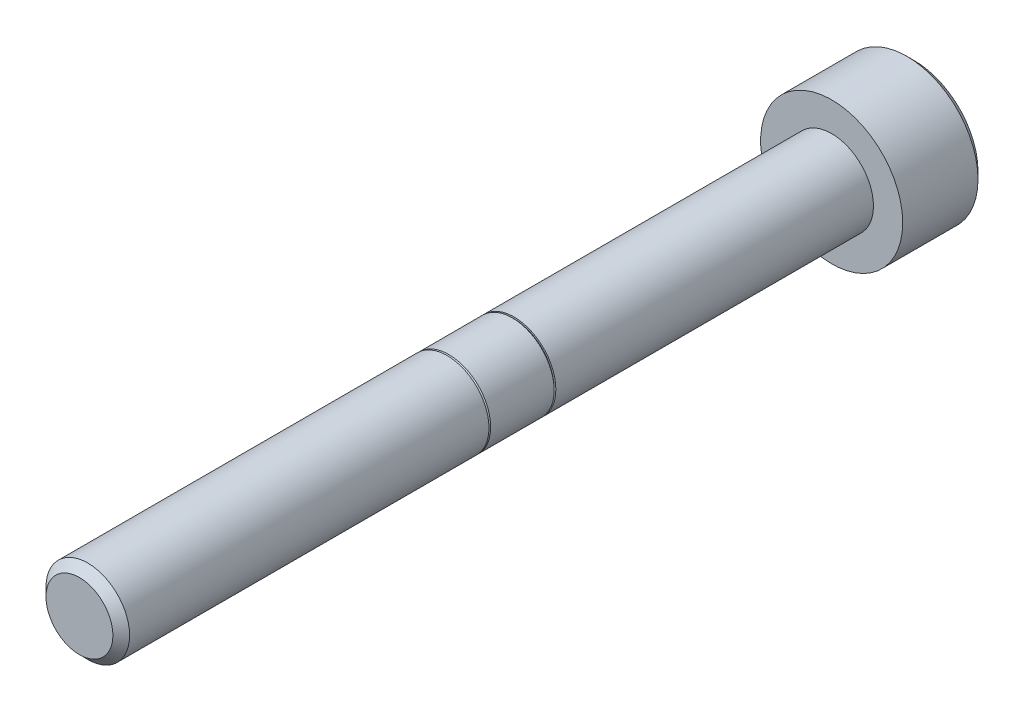
ISO-10303-21;
HEADER;
FILE_DESCRIPTION(('STEP AP214'),'2;1');
FILE_NAME('part.step','',(''),(''),'','','');
FILE_SCHEMA(('AUTOMOTIVE_DESIGN { 1 0 10303 214 1 1 1 1 }'));
ENDSEC;
DATA;
#1=APPLICATION_CONTEXT('core data for automotive mechanical design processes');
#2=APPLICATION_PROTOCOL_DEFINITION('international standard','automotive_design',2000,#1);
#3=PRODUCT_CONTEXT('',#1,'mechanical');
#4=PRODUCT('Part','Part','',(#3));
#5=PRODUCT_RELATED_PRODUCT_CATEGORY('part','',(#4));
#6=PRODUCT_DEFINITION_FORMATION('','',#4);
#7=PRODUCT_DEFINITION_CONTEXT('part definition',#1,'design');
#8=PRODUCT_DEFINITION('design','',#6,#7);
#9=PRODUCT_DEFINITION_SHAPE('','',#8);
#10=(LENGTH_UNIT() NAMED_UNIT(*) SI_UNIT(.MILLI.,.METRE.));
#11=(NAMED_UNIT(*) PLANE_ANGLE_UNIT() SI_UNIT($,.RADIAN.));
#12=(NAMED_UNIT(*) SI_UNIT($,.STERADIAN.) SOLID_ANGLE_UNIT());
#13=UNCERTAINTY_MEASURE_WITH_UNIT(LENGTH_MEASURE(1.E-05),#10,'distance_accuracy_value','');
#14=(GEOMETRIC_REPRESENTATION_CONTEXT(3) GLOBAL_UNCERTAINTY_ASSIGNED_CONTEXT((#13)) GLOBAL_UNIT_ASSIGNED_CONTEXT((#10,
#11,#12)) REPRESENTATION_CONTEXT('',''));
#15=CARTESIAN_POINT('',(0.,0.,0.));
#16=DIRECTION('',(0.,0.,1.));
#17=DIRECTION('',(1.,0.,0.));
#18=AXIS2_PLACEMENT_3D('',#15,#16,#17);
#19=CARTESIAN_POINT('',(0.,0.,-2.43));
#20=DIRECTION('',(0.,0.,1.));
#21=DIRECTION('',(1.,0.,0.));
#22=AXIS2_PLACEMENT_3D('',#19,#20,#21);
#23=PLANE('',#22);
#24=DIRECTION('',(0.866025403784439,0.499999999999999,0.));
#25=VECTOR('',#24,1.);
#26=CARTESIAN_POINT('',(2.,-1.15470053837925,-2.43));
#27=LINE('',#26,#25);
#28=CARTESIAN_POINT('',(2.,-1.15470053837925,-2.43));
#29=VERTEX_POINT('',#28);
#30=CARTESIAN_POINT('',(0.,-2.3094010767585,-2.43));
#31=VERTEX_POINT('',#30);
#32=EDGE_CURVE('E140',#29,#31,#27,.F.);
#33=ORIENTED_EDGE('',*,*,#32,.T.);
#34=DIRECTION('',(0.866025403784438,-0.5,0.));
#35=VECTOR('',#34,1.);
#36=CARTESIAN_POINT('',(0.,-2.3094010767585,-2.43));
#37=LINE('',#36,#35);
#38=CARTESIAN_POINT('',(-2.,-1.15470053837925,-2.43));
#39=VERTEX_POINT('',#38);
#40=EDGE_CURVE('E74',#31,#39,#37,.F.);
#41=ORIENTED_EDGE('',*,*,#40,.T.);
#42=DIRECTION('',(0.,1.,0.));
#43=VECTOR('',#42,1.);
#44=CARTESIAN_POINT('',(-2.,-1.15470053837925,-2.43));
#45=LINE('',#44,#43);
#46=CARTESIAN_POINT('',(-2.,1.15470053837925,-2.43));
#47=VERTEX_POINT('',#46);
#48=EDGE_CURVE('E71',#39,#47,#45,.T.);
#49=ORIENTED_EDGE('',*,*,#48,.T.);
#50=DIRECTION('',(-0.866025403784439,-0.5,0.));
#51=VECTOR('',#50,1.);
#52=CARTESIAN_POINT('',(-2.,1.15470053837925,-2.43));
#53=LINE('',#52,#51);
#54=CARTESIAN_POINT('',(0.,2.3094010767585,-2.43));
#55=VERTEX_POINT('',#54);
#56=EDGE_CURVE('E68',#47,#55,#53,.F.);
#57=ORIENTED_EDGE('',*,*,#56,.T.);
#58=DIRECTION('',(-0.866025403784439,0.5,0.));
#59=VECTOR('',#58,1.);
#60=CARTESIAN_POINT('',(0.,2.3094010767585,-2.43));
#61=LINE('',#60,#59);
#62=CARTESIAN_POINT('',(2.,1.15470053837925,-2.43));
#63=VERTEX_POINT('',#62);
#64=EDGE_CURVE('E91',#55,#63,#61,.F.);
#65=ORIENTED_EDGE('',*,*,#64,.T.);
#66=DIRECTION('',(0.,1.,0.));
#67=VECTOR('',#66,1.);
#68=CARTESIAN_POINT('',(2.,1.15470053837925,-2.43));
#69=LINE('',#68,#67);
#70=EDGE_CURVE('E145',#63,#29,#69,.F.);
#71=ORIENTED_EDGE('',*,*,#70,.T.);
#72=EDGE_LOOP('',(#33,#41,#49,#57,#65,#71));
#73=FACE_BOUND('',#72,.T.);
#74=ADVANCED_FACE('F17',(#73),#23,.F.);
#75=CARTESIAN_POINT('',(-2.,-1.15470053837925,-4.93));
#76=DIRECTION('',(-1.,0.,0.));
#77=DIRECTION('',(0.,0.,1.));
#78=AXIS2_PLACEMENT_3D('',#75,#76,#77);
#79=PLANE('',#78);
#80=ORIENTED_EDGE('',*,*,#48,.F.);
#81=DIRECTION('',(0.,0.,1.));
#82=VECTOR('',#81,1.);
#83=CARTESIAN_POINT('',(-2.,-1.15470053837925,-4.93));
#84=LINE('',#83,#82);
#85=CARTESIAN_POINT('',(-2.,-1.15470053837925,-4.93));
#86=VERTEX_POINT('',#85);
#87=EDGE_CURVE('E135',#39,#86,#84,.F.);
#88=ORIENTED_EDGE('',*,*,#87,.T.);
#89=DIRECTION('',(0.,1.,0.));
#90=VECTOR('',#89,1.);
#91=CARTESIAN_POINT('',(-2.,0.,-4.93));
#92=LINE('',#91,#90);
#93=CARTESIAN_POINT('',(-2.,1.15470053837925,-4.93));
#94=VERTEX_POINT('',#93);
#95=EDGE_CURVE('E82',#86,#94,#92,.T.);
#96=ORIENTED_EDGE('',*,*,#95,.T.);
#97=DIRECTION('',(0.,0.,1.));
#98=VECTOR('',#97,1.);
#99=CARTESIAN_POINT('',(-2.,1.15470053837925,-4.93));
#100=LINE('',#99,#98);
#101=EDGE_CURVE('E77',#94,#47,#100,.T.);
#102=ORIENTED_EDGE('',*,*,#101,.T.);
#103=EDGE_LOOP('',(#80,#88,#96,#102));
#104=FACE_BOUND('',#103,.T.);
#105=ADVANCED_FACE('F80',(#104),#79,.F.);
#106=CARTESIAN_POINT('',(-2.,1.15470053837925,-4.93));
#107=DIRECTION('',(-0.5,0.866025403784439,0.));
#108=DIRECTION('',(-0.866025403784439,-0.5,0.));
#109=AXIS2_PLACEMENT_3D('',#106,#107,#108);
#110=PLANE('',#109);
#111=ORIENTED_EDGE('',*,*,#56,.F.);
#112=ORIENTED_EDGE('',*,*,#101,.F.);
#113=DIRECTION('',(0.866025403784439,0.499999999999999,0.));
#114=VECTOR('',#113,1.);
#115=CARTESIAN_POINT('',(-2.,1.15470053837925,-4.93));
#116=LINE('',#115,#114);
#117=CARTESIAN_POINT('',(0.,2.3094010767585,-4.93));
#118=VERTEX_POINT('',#117);
#119=EDGE_CURVE('E132',#94,#118,#116,.T.);
#120=ORIENTED_EDGE('',*,*,#119,.T.);
#121=DIRECTION('',(0.,0.,1.));
#122=VECTOR('',#121,1.);
#123=CARTESIAN_POINT('',(0.,2.3094010767585,-4.93));
#124=LINE('',#123,#122);
#125=EDGE_CURVE('E88',#118,#55,#124,.T.);
#126=ORIENTED_EDGE('',*,*,#125,.T.);
#127=EDGE_LOOP('',(#111,#112,#120,#126));
#128=FACE_BOUND('',#127,.T.);
#129=ADVANCED_FACE('F86',(#128),#110,.F.);
#130=CARTESIAN_POINT('',(0.,2.3094010767585,-4.93));
#131=DIRECTION('',(0.5,0.866025403784439,0.));
#132=DIRECTION('',(-0.866025403784439,0.5,0.));
#133=AXIS2_PLACEMENT_3D('',#130,#131,#132);
#134=PLANE('',#133);
#135=ORIENTED_EDGE('',*,*,#64,.F.);
#136=ORIENTED_EDGE('',*,*,#125,.F.);
#137=DIRECTION('',(0.866025403784439,-0.5,0.));
#138=VECTOR('',#137,1.);
#139=CARTESIAN_POINT('',(0.,2.3094010767585,-4.93));
#140=LINE('',#139,#138);
#141=CARTESIAN_POINT('',(2.,1.15470053837925,-4.93));
#142=VERTEX_POINT('',#141);
#143=EDGE_CURVE('E130',#118,#142,#140,.T.);
#144=ORIENTED_EDGE('',*,*,#143,.T.);
#145=DIRECTION('',(0.,0.,-1.));
#146=VECTOR('',#145,1.);
#147=CARTESIAN_POINT('',(2.,1.15470053837925,-4.93));
#148=LINE('',#147,#146);
#149=EDGE_CURVE('E147',#142,#63,#148,.F.);
#150=ORIENTED_EDGE('',*,*,#149,.T.);
#151=EDGE_LOOP('',(#135,#136,#144,#150));
#152=FACE_BOUND('',#151,.T.);
#153=ADVANCED_FACE('F152',(#152),#134,.F.);
#154=CARTESIAN_POINT('',(2.,1.15470053837925,-4.93));
#155=DIRECTION('',(1.,0.,0.));
#156=DIRECTION('',(0.,0.,-1.));
#157=AXIS2_PLACEMENT_3D('',#154,#155,#156);
#158=PLANE('',#157);
#159=ORIENTED_EDGE('',*,*,#70,.F.);
#160=ORIENTED_EDGE('',*,*,#149,.F.);
#161=DIRECTION('',(0.,1.,0.));
#162=VECTOR('',#161,1.);
#163=CARTESIAN_POINT('',(2.,0.,-4.93));
#164=LINE('',#163,#162);
#165=CARTESIAN_POINT('',(2.,-1.15470053837925,-4.93));
#166=VERTEX_POINT('',#165);
#167=EDGE_CURVE('E128',#142,#166,#164,.F.);
#168=ORIENTED_EDGE('',*,*,#167,.T.);
#169=DIRECTION('',(0.,0.,1.));
#170=VECTOR('',#169,1.);
#171=CARTESIAN_POINT('',(2.,-1.15470053837925,-4.93));
#172=LINE('',#171,#170);
#173=EDGE_CURVE('E142',#166,#29,#172,.T.);
#174=ORIENTED_EDGE('',*,*,#173,.T.);
#175=EDGE_LOOP('',(#159,#160,#168,#174));
#176=FACE_BOUND('',#175,.T.);
#177=ADVANCED_FACE('F156',(#176),#158,.F.);
#178=CARTESIAN_POINT('',(2.,-1.15470053837925,-4.93));
#179=DIRECTION('',(0.499999999999999,-0.866025403784439,0.));
#180=DIRECTION('',(0.866025403784439,0.499999999999999,0.));
#181=AXIS2_PLACEMENT_3D('',#178,#179,#180);
#182=PLANE('',#181);
#183=ORIENTED_EDGE('',*,*,#32,.F.);
#184=ORIENTED_EDGE('',*,*,#173,.F.);
#185=DIRECTION('',(-0.866025403784439,-0.499999999999999,0.));
#186=VECTOR('',#185,1.);
#187=CARTESIAN_POINT('',(2.,-1.15470053837925,-4.93));
#188=LINE('',#187,#186);
#189=CARTESIAN_POINT('',(0.,-2.3094010767585,-4.93));
#190=VERTEX_POINT('',#189);
#191=EDGE_CURVE('E35',#166,#190,#188,.T.);
#192=ORIENTED_EDGE('',*,*,#191,.T.);
#193=DIRECTION('',(0.,0.,1.));
#194=VECTOR('',#193,1.);
#195=CARTESIAN_POINT('',(0.,-2.3094010767585,-4.93));
#196=LINE('',#195,#194);
#197=EDGE_CURVE('E138',#190,#31,#196,.T.);
#198=ORIENTED_EDGE('',*,*,#197,.T.);
#199=EDGE_LOOP('',(#183,#184,#192,#198));
#200=FACE_BOUND('',#199,.T.);
#201=ADVANCED_FACE('F158',(#200),#182,.F.);
#202=CARTESIAN_POINT('',(0.,-2.3094010767585,-4.93));
#203=DIRECTION('',(-0.5,-0.866025403784438,0.));
#204=DIRECTION('',(0.866025403784438,-0.5,0.));
#205=AXIS2_PLACEMENT_3D('',#202,#203,#204);
#206=PLANE('',#205);
#207=ORIENTED_EDGE('',*,*,#40,.F.);
#208=ORIENTED_EDGE('',*,*,#197,.F.);
#209=DIRECTION('',(-0.866025403784439,0.5,0.));
#210=VECTOR('',#209,1.);
#211=CARTESIAN_POINT('',(0.,-2.3094010767585,-4.93));
#212=LINE('',#211,#210);
#213=EDGE_CURVE('E121',#190,#86,#212,.T.);
#214=ORIENTED_EDGE('',*,*,#213,.T.);
#215=ORIENTED_EDGE('',*,*,#87,.F.);
#216=EDGE_LOOP('',(#207,#208,#214,#215));
#217=FACE_BOUND('',#216,.T.);
#218=ADVANCED_FACE('F161',(#217),#206,.F.);
#219=CARTESIAN_POINT('',(0.,0.,-4.93));
#220=DIRECTION('',(0.,0.,1.));
#221=DIRECTION('',(1.,0.,0.));
#222=AXIS2_PLACEMENT_3D('',#219,#220,#221);
#223=PLANE('',#222);
#224=ORIENTED_EDGE('',*,*,#191,.F.);
#225=ORIENTED_EDGE('',*,*,#167,.F.);
#226=ORIENTED_EDGE('',*,*,#143,.F.);
#227=ORIENTED_EDGE('',*,*,#119,.F.);
#228=ORIENTED_EDGE('',*,*,#95,.F.);
#229=ORIENTED_EDGE('',*,*,#213,.F.);
#230=EDGE_LOOP('',(#224,#225,#226,#227,#228,#229));
#231=FACE_BOUND('',#230,.T.);
#232=CARTESIAN_POINT('',(0.,0.,-4.9300000000585));
#233=DIRECTION('',(0.,0.,1.));
#234=DIRECTION('',(1.,0.,0.));
#235=AXIS2_PLACEMENT_3D('',#232,#233,#234);
#236=CIRCLE('',#235,3.82500000000618);
#237=CARTESIAN_POINT('',(3.82500000000618,0.,-4.9300000000585));
#238=VERTEX_POINT('',#237);
#239=EDGE_CURVE('E20',#238,#238,#236,.T.);
#240=ORIENTED_EDGE('',*,*,#239,.F.);
#241=EDGE_LOOP('',(#240));
#242=FACE_BOUND('',#241,.T.);
#243=ADVANCED_FACE('F163',(#231,#242),#223,.F.);
#244=CARTESIAN_POINT('',(0.,0.,-4.50499999999465));
#245=DIRECTION('',(0.,0.,1.));
#246=DIRECTION('',(1.,0.,0.));
#247=AXIS2_PLACEMENT_3D('',#244,#245,#246);
#248=CONICAL_SURFACE('',#247,4.25000000007003,0.785398163397448);
#249=ORIENTED_EDGE('',*,*,#239,.T.);
#250=EDGE_LOOP('',(#249));
#251=FACE_BOUND('',#250,.T.);
#252=CARTESIAN_POINT('',(0.,0.,-4.505));
#253=DIRECTION('',(0.,0.,1.));
#254=DIRECTION('',(1.,0.,0.));
#255=AXIS2_PLACEMENT_3D('',#252,#253,#254);
#256=CIRCLE('',#255,4.25);
#257=CARTESIAN_POINT('',(4.25,0.,-4.505));
#258=VERTEX_POINT('',#257);
#259=EDGE_CURVE('E113',#258,#258,#256,.T.);
#260=ORIENTED_EDGE('',*,*,#259,.F.);
#261=EDGE_LOOP('',(#260));
#262=FACE_BOUND('',#261,.T.);
#263=ADVANCED_FACE('F166',(#251,#262),#248,.T.);
#264=CARTESIAN_POINT('',(0.,0.,-4.93));
#265=DIRECTION('',(0.,0.,1.));
#266=DIRECTION('',(1.,0.,0.));
#267=AXIS2_PLACEMENT_3D('',#264,#265,#266);
#268=CYLINDRICAL_SURFACE('',#267,4.25);
#269=ORIENTED_EDGE('',*,*,#259,.T.);
#270=EDGE_LOOP('',(#269));
#271=FACE_BOUND('',#270,.T.);
#272=CARTESIAN_POINT('',(0.,0.,0.));
#273=DIRECTION('',(0.,0.,1.));
#274=DIRECTION('',(1.,0.,0.));
#275=AXIS2_PLACEMENT_3D('',#272,#273,#274);
#276=CIRCLE('',#275,4.25);
#277=CARTESIAN_POINT('',(4.25,0.,0.));
#278=VERTEX_POINT('',#277);
#279=EDGE_CURVE('E111',#278,#278,#276,.T.);
#280=ORIENTED_EDGE('',*,*,#279,.F.);
#281=EDGE_LOOP('',(#280));
#282=FACE_BOUND('',#281,.T.);
#283=ADVANCED_FACE('F172',(#271,#282),#268,.T.);
#284=CARTESIAN_POINT('',(0.,0.,0.));
#285=DIRECTION('',(0.,0.,1.));
#286=DIRECTION('',(1.,0.,0.));
#287=AXIS2_PLACEMENT_3D('',#284,#285,#286);
#288=PLANE('',#287);
#289=CARTESIAN_POINT('',(0.,0.,0.));
#290=DIRECTION('',(0.,0.,1.));
#291=DIRECTION('',(1.,0.,0.));
#292=AXIS2_PLACEMENT_3D('',#289,#290,#291);
#293=CIRCLE('',#292,2.5);
#294=CARTESIAN_POINT('',(2.5,0.,0.));
#295=VERTEX_POINT('',#294);
#296=EDGE_CURVE('E109',#295,#295,#293,.T.);
#297=ORIENTED_EDGE('',*,*,#296,.F.);
#298=EDGE_LOOP('',(#297));
#299=FACE_BOUND('',#298,.T.);
#300=ORIENTED_EDGE('',*,*,#279,.T.);
#301=EDGE_LOOP('',(#300));
#302=FACE_BOUND('',#301,.T.);
#303=ADVANCED_FACE('F178',(#299,#302),#288,.T.);
#304=CARTESIAN_POINT('',(0.,0.,0.));
#305=DIRECTION('',(0.,0.,1.));
#306=DIRECTION('',(1.,0.,0.));
#307=AXIS2_PLACEMENT_3D('',#304,#305,#306);
#308=CYLINDRICAL_SURFACE('',#307,2.5);
#309=ORIENTED_EDGE('',*,*,#296,.T.);
#310=EDGE_LOOP('',(#309));
#311=FACE_BOUND('',#310,.T.);
#312=CARTESIAN_POINT('',(0.,0.,19.));
#313=DIRECTION('',(0.,0.,1.));
#314=DIRECTION('',(1.,0.,0.));
#315=AXIS2_PLACEMENT_3D('',#312,#313,#314);
#316=CIRCLE('',#315,2.5);
#317=CARTESIAN_POINT('',(2.5,0.,19.));
#318=VERTEX_POINT('',#317);
#319=EDGE_CURVE('E106',#318,#318,#316,.T.);
#320=ORIENTED_EDGE('',*,*,#319,.F.);
#321=EDGE_LOOP('',(#320));
#322=FACE_BOUND('',#321,.T.);
#323=ADVANCED_FACE('F215',(#311,#322),#308,.T.);
#324=CARTESIAN_POINT('',(0.,0.,19.));
#325=DIRECTION('',(0.,0.,1.));
#326=DIRECTION('',(1.,0.,0.));
#327=AXIS2_PLACEMENT_3D('',#324,#325,#326);
#328=PLANE('',#327);
#329=CARTESIAN_POINT('',(0.,0.,19.0000000000055));
#330=DIRECTION('',(0.,0.,1.));
#331=DIRECTION('',(1.,0.,0.));
#332=AXIS2_PLACEMENT_3D('',#329,#330,#331);
#333=CIRCLE('',#332,2.40000000002283);
#334=CARTESIAN_POINT('',(2.40000000002283,0.,19.0000000000055));
#335=VERTEX_POINT('',#334);
#336=EDGE_CURVE('E102',#335,#335,#333,.T.);
#337=ORIENTED_EDGE('',*,*,#336,.F.);
#338=EDGE_LOOP('',(#337));
#339=FACE_BOUND('',#338,.T.);
#340=ORIENTED_EDGE('',*,*,#319,.T.);
#341=EDGE_LOOP('',(#340));
#342=FACE_BOUND('',#341,.T.);
#343=ADVANCED_FACE('F211',(#339,#342),#328,.T.);
#344=CARTESIAN_POINT('',(0.,0.,19.0999999999235));
#345=DIRECTION('',(0.,0.,1.));
#346=DIRECTION('',(1.,0.,0.));
#347=AXIS2_PLACEMENT_3D('',#344,#345,#346);
#348=CONICAL_SURFACE('',#347,2.49999999999773,0.785398163681665);
#349=ORIENTED_EDGE('',*,*,#336,.T.);
#350=EDGE_LOOP('',(#349));
#351=FACE_BOUND('',#350,.T.);
#352=CARTESIAN_POINT('',(0.,0.,19.1));
#353=DIRECTION('',(0.,0.,1.));
#354=DIRECTION('',(1.,0.,0.));
#355=AXIS2_PLACEMENT_3D('',#352,#353,#354);
#356=CIRCLE('',#355,2.5);
#357=CARTESIAN_POINT('',(2.5,0.,19.1));
#358=VERTEX_POINT('',#357);
#359=EDGE_CURVE('E105',#358,#358,#356,.T.);
#360=ORIENTED_EDGE('',*,*,#359,.F.);
#361=EDGE_LOOP('',(#360));
#362=FACE_BOUND('',#361,.T.);
#363=ADVANCED_FACE('F207',(#351,#362),#348,.T.);
#364=CARTESIAN_POINT('',(0.,0.,19.));
#365=DIRECTION('',(0.,0.,1.));
#366=DIRECTION('',(1.,0.,0.));
#367=AXIS2_PLACEMENT_3D('',#364,#365,#366);
#368=CYLINDRICAL_SURFACE('',#367,2.5);
#369=ORIENTED_EDGE('',*,*,#359,.T.);
#370=EDGE_LOOP('',(#369));
#371=FACE_BOUND('',#370,.T.);
#372=CARTESIAN_POINT('',(0.,0.,22.8999999999928));
#373=DIRECTION('',(0.,0.,-1.));
#374=DIRECTION('',(-1.,0.,0.));
#375=AXIS2_PLACEMENT_3D('',#372,#373,#374);
#376=CIRCLE('',#375,2.50000000005457);
#377=CARTESIAN_POINT('',(-2.50000000005457,0.,22.8999999999928));
#378=VERTEX_POINT('',#377);
#379=EDGE_CURVE('E101',#378,#378,#376,.F.);
#380=ORIENTED_EDGE('',*,*,#379,.F.);
#381=EDGE_LOOP('',(#380));
#382=FACE_BOUND('',#381,.T.);
#383=ADVANCED_FACE('F203',(#371,#382),#368,.T.);
#384=CARTESIAN_POINT('',(0.,0.,45.));
#385=DIRECTION('',(0.,0.,1.));
#386=DIRECTION('',(1.,0.,0.));
#387=AXIS2_PLACEMENT_3D('',#384,#385,#386);
#388=PLANE('',#387);
#389=CARTESIAN_POINT('',(0.,0.,45.0000000000159));
#390=DIRECTION('',(0.,0.,-1.));
#391=DIRECTION('',(-1.,0.,0.));
#392=AXIS2_PLACEMENT_3D('',#389,#390,#391);
#393=CIRCLE('',#392,1.99999999995271);
#394=CARTESIAN_POINT('',(-1.99999999995271,0.,45.0000000000159));
#395=VERTEX_POINT('',#394);
#396=EDGE_CURVE('E98',#395,#395,#393,.T.);
#397=ORIENTED_EDGE('',*,*,#396,.F.);
#398=EDGE_LOOP('',(#397));
#399=FACE_BOUND('',#398,.T.);
#400=ADVANCED_FACE('F199',(#399),#388,.T.);
#401=CARTESIAN_POINT('',(0.,0.,22.9000000000497));
#402=DIRECTION('',(0.,0.,-1.));
#403=DIRECTION('',(-1.,0.,0.));
#404=AXIS2_PLACEMENT_3D('',#401,#402,#403);
#405=CONICAL_SURFACE('',#404,2.49999999999773,0.785398163397448);
#406=ORIENTED_EDGE('',*,*,#379,.T.);
#407=EDGE_LOOP('',(#406));
#408=FACE_BOUND('',#407,.T.);
#409=CARTESIAN_POINT('',(0.,0.,23.0000000000246));
#410=DIRECTION('',(0.,0.,-1.));
#411=DIRECTION('',(-1.,0.,0.));
#412=AXIS2_PLACEMENT_3D('',#409,#410,#411);
#413=CIRCLE('',#412,2.40000000002283);
#414=CARTESIAN_POINT('',(-2.40000000002283,0.,23.0000000000246));
#415=VERTEX_POINT('',#414);
#416=EDGE_CURVE('E95',#415,#415,#413,.T.);
#417=ORIENTED_EDGE('',*,*,#416,.T.);
#418=EDGE_LOOP('',(#417));
#419=FACE_BOUND('',#418,.T.);
#420=ADVANCED_FACE('F195',(#408,#419),#405,.T.);
#421=CARTESIAN_POINT('',(0.,0.,44.4999999999141));
#422=DIRECTION('',(0.,0.,-1.));
#423=DIRECTION('',(-1.,0.,0.));
#424=AXIS2_PLACEMENT_3D('',#421,#422,#423);
#425=CONICAL_SURFACE('',#424,2.50000000005457,0.785398163397448);
#426=CARTESIAN_POINT('',(0.,0.,44.5));
#427=DIRECTION('',(0.,0.,1.));
#428=DIRECTION('',(1.,0.,0.));
#429=AXIS2_PLACEMENT_3D('',#426,#427,#428);
#430=CIRCLE('',#429,2.5);
#431=CARTESIAN_POINT('',(2.5,0.,44.5));
#432=VERTEX_POINT('',#431);
#433=EDGE_CURVE('E26',#432,#432,#430,.F.);
#434=ORIENTED_EDGE('',*,*,#433,.F.);
#435=EDGE_LOOP('',(#434));
#436=FACE_BOUND('',#435,.T.);
#437=ORIENTED_EDGE('',*,*,#396,.T.);
#438=EDGE_LOOP('',(#437));
#439=FACE_BOUND('',#438,.T.);
#440=ADVANCED_FACE('F188',(#436,#439),#425,.T.);
#441=CARTESIAN_POINT('',(0.,0.,23.));
#442=DIRECTION('',(0.,0.,1.));
#443=DIRECTION('',(1.,0.,0.));
#444=AXIS2_PLACEMENT_3D('',#441,#442,#443);
#445=PLANE('',#444);
#446=ORIENTED_EDGE('',*,*,#416,.F.);
#447=EDGE_LOOP('',(#446));
#448=FACE_BOUND('',#447,.T.);
#449=CARTESIAN_POINT('',(0.,0.,23.));
#450=DIRECTION('',(0.,0.,1.));
#451=DIRECTION('',(1.,0.,0.));
#452=AXIS2_PLACEMENT_3D('',#449,#450,#451);
#453=CIRCLE('',#452,2.5);
#454=CARTESIAN_POINT('',(2.5,0.,23.));
#455=VERTEX_POINT('',#454);
#456=EDGE_CURVE('E11',#455,#455,#453,.T.);
#457=ORIENTED_EDGE('',*,*,#456,.F.);
#458=EDGE_LOOP('',(#457));
#459=FACE_BOUND('',#458,.T.);
#460=ADVANCED_FACE('F182',(#448,#459),#445,.F.);
#461=CARTESIAN_POINT('',(0.,0.,23.));
#462=DIRECTION('',(0.,0.,1.));
#463=DIRECTION('',(1.,0.,0.));
#464=AXIS2_PLACEMENT_3D('',#461,#462,#463);
#465=CYLINDRICAL_SURFACE('',#464,2.5);
#466=ORIENTED_EDGE('',*,*,#456,.T.);
#467=EDGE_LOOP('',(#466));
#468=FACE_BOUND('',#467,.T.);
#469=ORIENTED_EDGE('',*,*,#433,.T.);
#470=EDGE_LOOP('',(#469));
#471=FACE_BOUND('',#470,.T.);
#472=ADVANCED_FACE('F180',(#468,#471),#465,.T.);
#473=CLOSED_SHELL('',(#74,#105,#129,#153,#177,#201,#218,#243,#263,#283,#303,#323,#343,#363,#383,
#400,#420,#440,#460,#472));
#474=MANIFOLD_SOLID_BREP('B1',#473);
#475=ADVANCED_BREP_SHAPE_REPRESENTATION('',(#18,#474),#14);
#476=SHAPE_DEFINITION_REPRESENTATION(#9,#475);
ENDSEC;
END-ISO-10303-21;
